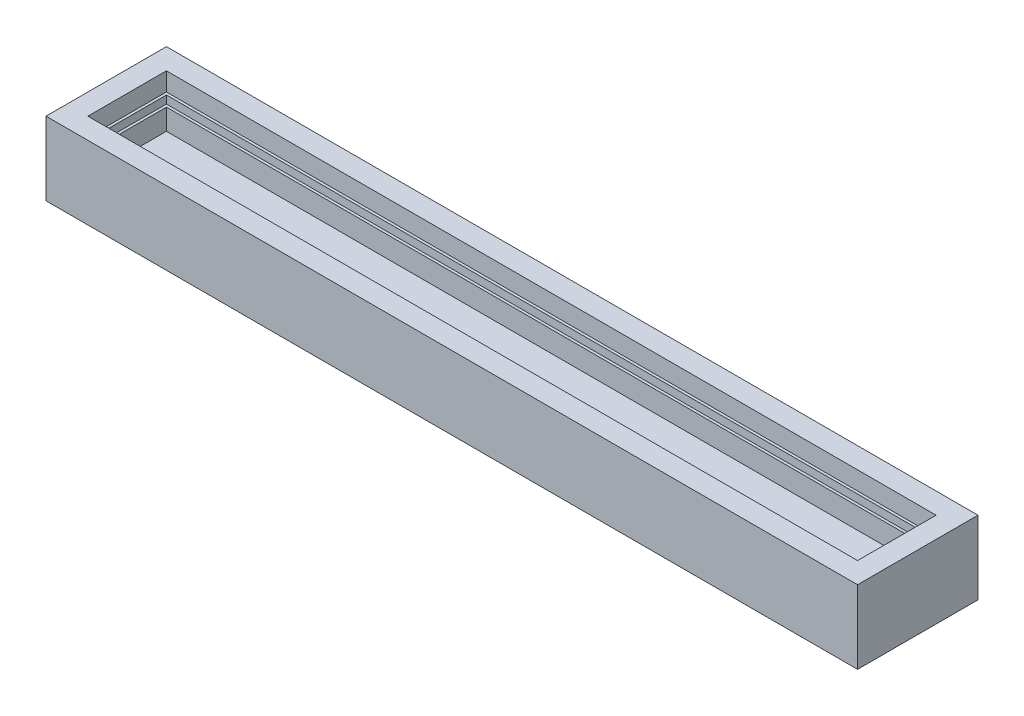
ISO-10303-21;
HEADER;
FILE_DESCRIPTION(('STEP AP214'),'2;1');
FILE_NAME('part.step','',(''),(''),'','','');
FILE_SCHEMA(('AUTOMOTIVE_DESIGN { 1 0 10303 214 1 1 1 1 }'));
ENDSEC;
DATA;
#1=APPLICATION_CONTEXT('core data for automotive mechanical design processes');
#2=APPLICATION_PROTOCOL_DEFINITION('international standard','automotive_design',2000,#1);
#3=PRODUCT_CONTEXT('',#1,'mechanical');
#4=PRODUCT('Part','Part','',(#3));
#5=PRODUCT_RELATED_PRODUCT_CATEGORY('part','',(#4));
#6=PRODUCT_DEFINITION_FORMATION('','',#4);
#7=PRODUCT_DEFINITION_CONTEXT('part definition',#1,'design');
#8=PRODUCT_DEFINITION('design','',#6,#7);
#9=PRODUCT_DEFINITION_SHAPE('','',#8);
#10=(LENGTH_UNIT() NAMED_UNIT(*) SI_UNIT(.MILLI.,.METRE.));
#11=(NAMED_UNIT(*) PLANE_ANGLE_UNIT() SI_UNIT($,.RADIAN.));
#12=(NAMED_UNIT(*) SI_UNIT($,.STERADIAN.) SOLID_ANGLE_UNIT());
#13=UNCERTAINTY_MEASURE_WITH_UNIT(LENGTH_MEASURE(1.E-05),#10,'distance_accuracy_value','');
#14=(GEOMETRIC_REPRESENTATION_CONTEXT(3) GLOBAL_UNCERTAINTY_ASSIGNED_CONTEXT((#13)) GLOBAL_UNIT_ASSIGNED_CONTEXT((#10,
#11,#12)) REPRESENTATION_CONTEXT('',''));
#15=CARTESIAN_POINT('',(0.,0.,0.));
#16=DIRECTION('',(0.,0.,1.));
#17=DIRECTION('',(1.,0.,0.));
#18=AXIS2_PLACEMENT_3D('',#15,#16,#17);
#19=CARTESIAN_POINT('',(73.5,10.,7.5));
#20=DIRECTION('',(-1.,0.,0.));
#21=DIRECTION('',(0.,0.,1.));
#22=AXIS2_PLACEMENT_3D('',#19,#20,#21);
#23=PLANE('',#22);
#24=DIRECTION('',(0.,-1.,0.));
#25=VECTOR('',#24,1.);
#26=CARTESIAN_POINT('',(73.5,10.,7.5));
#27=LINE('',#26,#25);
#28=CARTESIAN_POINT('',(73.5,6.,7.5));
#29=VERTEX_POINT('',#28);
#30=CARTESIAN_POINT('',(73.5,4.5,7.5));
#31=VERTEX_POINT('',#30);
#32=EDGE_CURVE('E328',#29,#31,#27,.T.);
#33=ORIENTED_EDGE('',*,*,#32,.F.);
#34=DIRECTION('',(0.,0.,-1.));
#35=VECTOR('',#34,1.);
#36=CARTESIAN_POINT('',(73.5,6.,7.5));
#37=LINE('',#36,#35);
#38=CARTESIAN_POINT('',(73.5,6.,-7.5));
#39=VERTEX_POINT('',#38);
#40=EDGE_CURVE('E49',#29,#39,#37,.T.);
#41=ORIENTED_EDGE('',*,*,#40,.T.);
#42=DIRECTION('',(0.,-1.,0.));
#43=VECTOR('',#42,1.);
#44=CARTESIAN_POINT('',(73.5,10.,-7.5));
#45=LINE('',#44,#43);
#46=CARTESIAN_POINT('',(73.5,4.5,-7.5));
#47=VERTEX_POINT('',#46);
#48=EDGE_CURVE('E343',#39,#47,#45,.T.);
#49=ORIENTED_EDGE('',*,*,#48,.T.);
#50=DIRECTION('',(0.,0.,-1.));
#51=VECTOR('',#50,1.);
#52=CARTESIAN_POINT('',(73.5,4.5,7.5));
#53=LINE('',#52,#51);
#54=EDGE_CURVE('E247',#31,#47,#53,.T.);
#55=ORIENTED_EDGE('',*,*,#54,.F.);
#56=EDGE_LOOP('',(#33,#41,#49,#55));
#57=FACE_BOUND('',#56,.T.);
#58=ADVANCED_FACE('F34',(#57),#23,.T.);
#59=CARTESIAN_POINT('',(-73.5,10.,-7.5));
#60=DIRECTION('',(0.,0.,1.));
#61=DIRECTION('',(1.,0.,0.));
#62=AXIS2_PLACEMENT_3D('',#59,#60,#61);
#63=PLANE('',#62);
#64=ORIENTED_EDGE('',*,*,#48,.F.);
#65=DIRECTION('',(-1.,0.,0.));
#66=VECTOR('',#65,1.);
#67=CARTESIAN_POINT('',(-73.5,6.,-7.5));
#68=LINE('',#67,#66);
#69=CARTESIAN_POINT('',(-73.5,6.,-7.5));
#70=VERTEX_POINT('',#69);
#71=EDGE_CURVE('E222',#39,#70,#68,.T.);
#72=ORIENTED_EDGE('',*,*,#71,.T.);
#73=DIRECTION('',(0.,-1.,0.));
#74=VECTOR('',#73,1.);
#75=CARTESIAN_POINT('',(-73.5,10.,-7.5));
#76=LINE('',#75,#74);
#77=CARTESIAN_POINT('',(-73.5,4.5,-7.5));
#78=VERTEX_POINT('',#77);
#79=EDGE_CURVE('E338',#70,#78,#76,.T.);
#80=ORIENTED_EDGE('',*,*,#79,.T.);
#81=DIRECTION('',(-1.,0.,0.));
#82=VECTOR('',#81,1.);
#83=CARTESIAN_POINT('',(73.5,4.5,-7.5));
#84=LINE('',#83,#82);
#85=EDGE_CURVE('E237',#47,#78,#84,.T.);
#86=ORIENTED_EDGE('',*,*,#85,.F.);
#87=EDGE_LOOP('',(#64,#72,#80,#86));
#88=FACE_BOUND('',#87,.T.);
#89=ADVANCED_FACE('F391',(#88),#63,.T.);
#90=CARTESIAN_POINT('',(-73.5,10.,7.5));
#91=DIRECTION('',(1.,0.,0.));
#92=DIRECTION('',(0.,0.,-1.));
#93=AXIS2_PLACEMENT_3D('',#90,#91,#92);
#94=PLANE('',#93);
#95=ORIENTED_EDGE('',*,*,#79,.F.);
#96=DIRECTION('',(0.,0.,1.));
#97=VECTOR('',#96,1.);
#98=CARTESIAN_POINT('',(-73.5,6.,7.5));
#99=LINE('',#98,#97);
#100=CARTESIAN_POINT('',(-73.5,6.,7.5));
#101=VERTEX_POINT('',#100);
#102=EDGE_CURVE('E218',#70,#101,#99,.T.);
#103=ORIENTED_EDGE('',*,*,#102,.T.);
#104=DIRECTION('',(0.,-1.,0.));
#105=VECTOR('',#104,1.);
#106=CARTESIAN_POINT('',(-73.5,10.,7.5));
#107=LINE('',#106,#105);
#108=CARTESIAN_POINT('',(-73.5,4.5,7.5));
#109=VERTEX_POINT('',#108);
#110=EDGE_CURVE('E333',#101,#109,#107,.T.);
#111=ORIENTED_EDGE('',*,*,#110,.T.);
#112=DIRECTION('',(0.,0.,1.));
#113=VECTOR('',#112,1.);
#114=CARTESIAN_POINT('',(-73.5,4.5,-7.5));
#115=LINE('',#114,#113);
#116=EDGE_CURVE('E240',#78,#109,#115,.T.);
#117=ORIENTED_EDGE('',*,*,#116,.F.);
#118=EDGE_LOOP('',(#95,#103,#111,#117));
#119=FACE_BOUND('',#118,.T.);
#120=ADVANCED_FACE('F386',(#119),#94,.T.);
#121=CARTESIAN_POINT('',(-73.5,10.,7.5));
#122=DIRECTION('',(0.,0.,-1.));
#123=DIRECTION('',(-1.,0.,0.));
#124=AXIS2_PLACEMENT_3D('',#121,#122,#123);
#125=PLANE('',#124);
#126=ORIENTED_EDGE('',*,*,#110,.F.);
#127=DIRECTION('',(1.,0.,0.));
#128=VECTOR('',#127,1.);
#129=CARTESIAN_POINT('',(-73.5,6.,7.5));
#130=LINE('',#129,#128);
#131=EDGE_CURVE('E42',#101,#29,#130,.T.);
#132=ORIENTED_EDGE('',*,*,#131,.T.);
#133=ORIENTED_EDGE('',*,*,#32,.T.);
#134=DIRECTION('',(1.,0.,0.));
#135=VECTOR('',#134,1.);
#136=CARTESIAN_POINT('',(-73.5,4.5,7.5));
#137=LINE('',#136,#135);
#138=EDGE_CURVE('E244',#109,#31,#137,.T.);
#139=ORIENTED_EDGE('',*,*,#138,.F.);
#140=EDGE_LOOP('',(#126,#132,#133,#139));
#141=FACE_BOUND('',#140,.T.);
#142=ADVANCED_FACE('F362',(#141),#125,.T.);
#143=CARTESIAN_POINT('',(0.,4.5,0.));
#144=DIRECTION('',(0.,1.,0.));
#145=DIRECTION('',(0.,0.,1.));
#146=AXIS2_PLACEMENT_3D('',#143,#144,#145);
#147=PLANE('',#146);
#148=DIRECTION('',(-1.,0.,0.));
#149=VECTOR('',#148,1.);
#150=CARTESIAN_POINT('',(74.5,4.5,-8.5));
#151=LINE('',#150,#149);
#152=CARTESIAN_POINT('',(74.5,4.5,-8.5));
#153=VERTEX_POINT('',#152);
#154=CARTESIAN_POINT('',(-74.5,4.5,-8.5));
#155=VERTEX_POINT('',#154);
#156=EDGE_CURVE('E261',#153,#155,#151,.T.);
#157=ORIENTED_EDGE('',*,*,#156,.F.);
#158=DIRECTION('',(0.,0.,-1.));
#159=VECTOR('',#158,1.);
#160=CARTESIAN_POINT('',(74.5,4.5,8.5));
#161=LINE('',#160,#159);
#162=CARTESIAN_POINT('',(74.5,4.5,8.5));
#163=VERTEX_POINT('',#162);
#164=EDGE_CURVE('E269',#163,#153,#161,.T.);
#165=ORIENTED_EDGE('',*,*,#164,.F.);
#166=DIRECTION('',(1.,0.,0.));
#167=VECTOR('',#166,1.);
#168=CARTESIAN_POINT('',(-74.5,4.5,8.5));
#169=LINE('',#168,#167);
#170=CARTESIAN_POINT('',(-74.5,4.5,8.5));
#171=VERTEX_POINT('',#170);
#172=EDGE_CURVE('E267',#171,#163,#169,.T.);
#173=ORIENTED_EDGE('',*,*,#172,.F.);
#174=DIRECTION('',(0.,0.,1.));
#175=VECTOR('',#174,1.);
#176=CARTESIAN_POINT('',(-74.5,4.5,-8.5));
#177=LINE('',#176,#175);
#178=EDGE_CURVE('E264',#155,#171,#177,.T.);
#179=ORIENTED_EDGE('',*,*,#178,.F.);
#180=EDGE_LOOP('',(#157,#165,#173,#179));
#181=FACE_BOUND('',#180,.T.);
#182=ORIENTED_EDGE('',*,*,#116,.T.);
#183=ORIENTED_EDGE('',*,*,#138,.T.);
#184=ORIENTED_EDGE('',*,*,#54,.T.);
#185=ORIENTED_EDGE('',*,*,#85,.T.);
#186=EDGE_LOOP('',(#182,#183,#184,#185));
#187=FACE_BOUND('',#186,.T.);
#188=ADVANCED_FACE('F388',(#181,#187),#147,.F.);
#189=CARTESIAN_POINT('',(0.,4.,0.));
#190=DIRECTION('',(0.,1.,0.));
#191=DIRECTION('',(0.,0.,1.));
#192=AXIS2_PLACEMENT_3D('',#189,#190,#191);
#193=PLANE('',#192);
#194=DIRECTION('',(-1.,0.,0.));
#195=VECTOR('',#194,1.);
#196=CARTESIAN_POINT('',(74.5,4.,-8.5));
#197=LINE('',#196,#195);
#198=CARTESIAN_POINT('',(74.5,4.,-8.5));
#199=VERTEX_POINT('',#198);
#200=CARTESIAN_POINT('',(-74.5,4.,-8.5));
#201=VERTEX_POINT('',#200);
#202=EDGE_CURVE('E250',#199,#201,#197,.T.);
#203=ORIENTED_EDGE('',*,*,#202,.T.);
#204=DIRECTION('',(0.,0.,1.));
#205=VECTOR('',#204,1.);
#206=CARTESIAN_POINT('',(-74.5,4.,-8.5));
#207=LINE('',#206,#205);
#208=CARTESIAN_POINT('',(-74.5,4.,8.5));
#209=VERTEX_POINT('',#208);
#210=EDGE_CURVE('E274',#201,#209,#207,.T.);
#211=ORIENTED_EDGE('',*,*,#210,.T.);
#212=DIRECTION('',(1.,0.,0.));
#213=VECTOR('',#212,1.);
#214=CARTESIAN_POINT('',(-74.5,4.,8.5));
#215=LINE('',#214,#213);
#216=CARTESIAN_POINT('',(74.5,4.,8.5));
#217=VERTEX_POINT('',#216);
#218=EDGE_CURVE('E276',#209,#217,#215,.T.);
#219=ORIENTED_EDGE('',*,*,#218,.T.);
#220=DIRECTION('',(0.,0.,-1.));
#221=VECTOR('',#220,1.);
#222=CARTESIAN_POINT('',(74.5,4.,8.5));
#223=LINE('',#222,#221);
#224=EDGE_CURVE('E265',#217,#199,#223,.T.);
#225=ORIENTED_EDGE('',*,*,#224,.T.);
#226=EDGE_LOOP('',(#203,#211,#219,#225));
#227=FACE_BOUND('',#226,.T.);
#228=DIRECTION('',(-1.,0.,0.));
#229=VECTOR('',#228,1.);
#230=CARTESIAN_POINT('',(73.5,4.,-7.5));
#231=LINE('',#230,#229);
#232=CARTESIAN_POINT('',(73.5,4.,-7.5));
#233=VERTEX_POINT('',#232);
#234=CARTESIAN_POINT('',(-73.5,4.,-7.5));
#235=VERTEX_POINT('',#234);
#236=EDGE_CURVE('E236',#233,#235,#231,.T.);
#237=ORIENTED_EDGE('',*,*,#236,.F.);
#238=DIRECTION('',(0.,0.,-1.));
#239=VECTOR('',#238,1.);
#240=CARTESIAN_POINT('',(73.5,4.,7.5));
#241=LINE('',#240,#239);
#242=CARTESIAN_POINT('',(73.5,4.,7.5));
#243=VERTEX_POINT('',#242);
#244=EDGE_CURVE('E241',#243,#233,#241,.T.);
#245=ORIENTED_EDGE('',*,*,#244,.F.);
#246=DIRECTION('',(1.,0.,0.));
#247=VECTOR('',#246,1.);
#248=CARTESIAN_POINT('',(-73.5,4.,7.5));
#249=LINE('',#248,#247);
#250=CARTESIAN_POINT('',(-73.5,4.,7.5));
#251=VERTEX_POINT('',#250);
#252=EDGE_CURVE('E256',#251,#243,#249,.T.);
#253=ORIENTED_EDGE('',*,*,#252,.F.);
#254=DIRECTION('',(0.,0.,1.));
#255=VECTOR('',#254,1.);
#256=CARTESIAN_POINT('',(-73.5,4.,-7.5));
#257=LINE('',#256,#255);
#258=EDGE_CURVE('E253',#235,#251,#257,.T.);
#259=ORIENTED_EDGE('',*,*,#258,.F.);
#260=EDGE_LOOP('',(#237,#245,#253,#259));
#261=FACE_BOUND('',#260,.T.);
#262=ADVANCED_FACE('F395',(#227,#261),#193,.T.);
#263=CARTESIAN_POINT('',(74.5,4.5,-8.5));
#264=DIRECTION('',(0.,0.,1.));
#265=DIRECTION('',(1.,0.,0.));
#266=AXIS2_PLACEMENT_3D('',#263,#264,#265);
#267=PLANE('',#266);
#268=ORIENTED_EDGE('',*,*,#202,.F.);
#269=DIRECTION('',(0.,-1.,0.));
#270=VECTOR('',#269,1.);
#271=CARTESIAN_POINT('',(74.5,4.5,-8.5));
#272=LINE('',#271,#270);
#273=EDGE_CURVE('E271',#153,#199,#272,.T.);
#274=ORIENTED_EDGE('',*,*,#273,.F.);
#275=ORIENTED_EDGE('',*,*,#156,.T.);
#276=DIRECTION('',(0.,-1.,0.));
#277=VECTOR('',#276,1.);
#278=CARTESIAN_POINT('',(-74.5,4.5,-8.5));
#279=LINE('',#278,#277);
#280=EDGE_CURVE('E287',#155,#201,#279,.T.);
#281=ORIENTED_EDGE('',*,*,#280,.T.);
#282=EDGE_LOOP('',(#268,#274,#275,#281));
#283=FACE_BOUND('',#282,.T.);
#284=ADVANCED_FACE('F397',(#283),#267,.T.);
#285=CARTESIAN_POINT('',(-74.5,4.5,-8.5));
#286=DIRECTION('',(1.,0.,0.));
#287=DIRECTION('',(0.,0.,-1.));
#288=AXIS2_PLACEMENT_3D('',#285,#286,#287);
#289=PLANE('',#288);
#290=ORIENTED_EDGE('',*,*,#210,.F.);
#291=ORIENTED_EDGE('',*,*,#280,.F.);
#292=ORIENTED_EDGE('',*,*,#178,.T.);
#293=DIRECTION('',(0.,-1.,0.));
#294=VECTOR('',#293,1.);
#295=CARTESIAN_POINT('',(-74.5,4.5,8.5));
#296=LINE('',#295,#294);
#297=EDGE_CURVE('E284',#171,#209,#296,.T.);
#298=ORIENTED_EDGE('',*,*,#297,.T.);
#299=EDGE_LOOP('',(#290,#291,#292,#298));
#300=FACE_BOUND('',#299,.T.);
#301=ADVANCED_FACE('F404',(#300),#289,.T.);
#302=CARTESIAN_POINT('',(-74.5,4.5,8.5));
#303=DIRECTION('',(0.,0.,-1.));
#304=DIRECTION('',(-1.,0.,0.));
#305=AXIS2_PLACEMENT_3D('',#302,#303,#304);
#306=PLANE('',#305);
#307=ORIENTED_EDGE('',*,*,#218,.F.);
#308=ORIENTED_EDGE('',*,*,#297,.F.);
#309=ORIENTED_EDGE('',*,*,#172,.T.);
#310=DIRECTION('',(0.,-1.,0.));
#311=VECTOR('',#310,1.);
#312=CARTESIAN_POINT('',(74.5,4.5,8.5));
#313=LINE('',#312,#311);
#314=EDGE_CURVE('E281',#163,#217,#313,.T.);
#315=ORIENTED_EDGE('',*,*,#314,.T.);
#316=EDGE_LOOP('',(#307,#308,#309,#315));
#317=FACE_BOUND('',#316,.T.);
#318=ADVANCED_FACE('F494',(#317),#306,.T.);
#319=CARTESIAN_POINT('',(74.5,4.5,8.5));
#320=DIRECTION('',(-1.,0.,0.));
#321=DIRECTION('',(0.,0.,1.));
#322=AXIS2_PLACEMENT_3D('',#319,#320,#321);
#323=PLANE('',#322);
#324=ORIENTED_EDGE('',*,*,#224,.F.);
#325=ORIENTED_EDGE('',*,*,#314,.F.);
#326=ORIENTED_EDGE('',*,*,#164,.T.);
#327=ORIENTED_EDGE('',*,*,#273,.T.);
#328=EDGE_LOOP('',(#324,#325,#326,#327));
#329=FACE_BOUND('',#328,.T.);
#330=ADVANCED_FACE('F456',(#329),#323,.T.);
#331=CARTESIAN_POINT('',(0.,0.,0.));
#332=DIRECTION('',(0.,-1.,0.));
#333=DIRECTION('',(0.,0.,-1.));
#334=AXIS2_PLACEMENT_3D('',#331,#332,#333);
#335=PLANE('',#334);
#336=DIRECTION('',(0.,0.,1.));
#337=VECTOR('',#336,1.);
#338=CARTESIAN_POINT('',(-73.5,0.,7.5));
#339=LINE('',#338,#337);
#340=CARTESIAN_POINT('',(-73.5,0.,-7.5));
#341=VERTEX_POINT('',#340);
#342=CARTESIAN_POINT('',(-73.5,0.,7.5));
#343=VERTEX_POINT('',#342);
#344=EDGE_CURVE('E319',#341,#343,#339,.T.);
#345=ORIENTED_EDGE('',*,*,#344,.T.);
#346=DIRECTION('',(1.,0.,0.));
#347=VECTOR('',#346,1.);
#348=CARTESIAN_POINT('',(-73.5,0.,7.5));
#349=LINE('',#348,#347);
#350=CARTESIAN_POINT('',(73.5,0.,7.5));
#351=VERTEX_POINT('',#350);
#352=EDGE_CURVE('E306',#343,#351,#349,.T.);
#353=ORIENTED_EDGE('',*,*,#352,.T.);
#354=DIRECTION('',(0.,0.,-1.));
#355=VECTOR('',#354,1.);
#356=CARTESIAN_POINT('',(73.5,0.,7.5));
#357=LINE('',#356,#355);
#358=CARTESIAN_POINT('',(73.5,0.,-7.5));
#359=VERTEX_POINT('',#358);
#360=EDGE_CURVE('E302',#351,#359,#357,.T.);
#361=ORIENTED_EDGE('',*,*,#360,.T.);
#362=DIRECTION('',(-1.,0.,0.));
#363=VECTOR('',#362,1.);
#364=CARTESIAN_POINT('',(-73.5,0.,-7.5));
#365=LINE('',#364,#363);
#366=EDGE_CURVE('E316',#359,#341,#365,.T.);
#367=ORIENTED_EDGE('',*,*,#366,.T.);
#368=EDGE_LOOP('',(#345,#353,#361,#367));
#369=FACE_BOUND('',#368,.T.);
#370=ADVANCED_FACE('F378',(#369),#335,.F.);
#371=EDGE_CURVE('E327',#251,#343,#107,.T.);
#372=ORIENTED_EDGE('',*,*,#371,.F.);
#373=ORIENTED_EDGE('',*,*,#252,.T.);
#374=EDGE_CURVE('E313',#243,#351,#27,.T.);
#375=ORIENTED_EDGE('',*,*,#374,.T.);
#376=ORIENTED_EDGE('',*,*,#352,.F.);
#377=EDGE_LOOP('',(#372,#373,#375,#376));
#378=FACE_BOUND('',#377,.T.);
#379=ADVANCED_FACE('F372',(#378),#125,.T.);
#380=EDGE_CURVE('E332',#235,#341,#76,.T.);
#381=ORIENTED_EDGE('',*,*,#380,.F.);
#382=ORIENTED_EDGE('',*,*,#258,.T.);
#383=ORIENTED_EDGE('',*,*,#371,.T.);
#384=ORIENTED_EDGE('',*,*,#344,.F.);
#385=EDGE_LOOP('',(#381,#382,#383,#384));
#386=FACE_BOUND('',#385,.T.);
#387=ADVANCED_FACE('F382',(#386),#94,.T.);
#388=EDGE_CURVE('E337',#233,#359,#45,.T.);
#389=ORIENTED_EDGE('',*,*,#388,.F.);
#390=ORIENTED_EDGE('',*,*,#236,.T.);
#391=ORIENTED_EDGE('',*,*,#380,.T.);
#392=ORIENTED_EDGE('',*,*,#366,.F.);
#393=EDGE_LOOP('',(#389,#390,#391,#392));
#394=FACE_BOUND('',#393,.T.);
#395=ADVANCED_FACE('F393',(#394),#63,.T.);
#396=ORIENTED_EDGE('',*,*,#374,.F.);
#397=ORIENTED_EDGE('',*,*,#244,.T.);
#398=ORIENTED_EDGE('',*,*,#388,.T.);
#399=ORIENTED_EDGE('',*,*,#360,.F.);
#400=EDGE_LOOP('',(#396,#397,#398,#399));
#401=FACE_BOUND('',#400,.T.);
#402=ADVANCED_FACE('F374',(#401),#23,.T.);
#403=CARTESIAN_POINT('',(74.5,6.5,8.5));
#404=DIRECTION('',(-1.,0.,0.));
#405=DIRECTION('',(0.,0.,1.));
#406=AXIS2_PLACEMENT_3D('',#403,#404,#405);
#407=PLANE('',#406);
#408=DIRECTION('',(0.,0.,-1.));
#409=VECTOR('',#408,1.);
#410=CARTESIAN_POINT('',(74.5,6.,8.5));
#411=LINE('',#410,#409);
#412=CARTESIAN_POINT('',(74.5,6.,8.5));
#413=VERTEX_POINT('',#412);
#414=CARTESIAN_POINT('',(74.5,6.,-8.5));
#415=VERTEX_POINT('',#414);
#416=EDGE_CURVE('E702',#413,#415,#411,.T.);
#417=ORIENTED_EDGE('',*,*,#416,.F.);
#418=DIRECTION('',(0.,-1.,0.));
#419=VECTOR('',#418,1.);
#420=CARTESIAN_POINT('',(74.5,6.5,8.5));
#421=LINE('',#420,#419);
#422=CARTESIAN_POINT('',(74.5,6.5,8.5));
#423=VERTEX_POINT('',#422);
#424=EDGE_CURVE('E213',#423,#413,#421,.T.);
#425=ORIENTED_EDGE('',*,*,#424,.F.);
#426=DIRECTION('',(0.,0.,-1.));
#427=VECTOR('',#426,1.);
#428=CARTESIAN_POINT('',(74.5,6.5,8.5));
#429=LINE('',#428,#427);
#430=CARTESIAN_POINT('',(74.5,6.5,-8.5));
#431=VERTEX_POINT('',#430);
#432=EDGE_CURVE('E198',#423,#431,#429,.T.);
#433=ORIENTED_EDGE('',*,*,#432,.T.);
#434=DIRECTION('',(0.,-1.,0.));
#435=VECTOR('',#434,1.);
#436=CARTESIAN_POINT('',(74.5,6.5,-8.5));
#437=LINE('',#436,#435);
#438=EDGE_CURVE('E210',#431,#415,#437,.T.);
#439=ORIENTED_EDGE('',*,*,#438,.T.);
#440=EDGE_LOOP('',(#417,#425,#433,#439));
#441=FACE_BOUND('',#440,.T.);
#442=ADVANCED_FACE('F209',(#441),#407,.T.);
#443=CARTESIAN_POINT('',(74.5,6.5,-8.5));
#444=DIRECTION('',(0.,0.,1.));
#445=DIRECTION('',(1.,0.,0.));
#446=AXIS2_PLACEMENT_3D('',#443,#444,#445);
#447=PLANE('',#446);
#448=DIRECTION('',(-1.,0.,0.));
#449=VECTOR('',#448,1.);
#450=CARTESIAN_POINT('',(74.5,6.,-8.5));
#451=LINE('',#450,#449);
#452=CARTESIAN_POINT('',(-74.5,6.,-8.5));
#453=VERTEX_POINT('',#452);
#454=EDGE_CURVE('E217',#415,#453,#451,.T.);
#455=ORIENTED_EDGE('',*,*,#454,.F.);
#456=ORIENTED_EDGE('',*,*,#438,.F.);
#457=DIRECTION('',(-1.,0.,0.));
#458=VECTOR('',#457,1.);
#459=CARTESIAN_POINT('',(74.5,6.5,-8.5));
#460=LINE('',#459,#458);
#461=CARTESIAN_POINT('',(-74.5,6.5,-8.5));
#462=VERTEX_POINT('',#461);
#463=EDGE_CURVE('E194',#431,#462,#460,.T.);
#464=ORIENTED_EDGE('',*,*,#463,.T.);
#465=DIRECTION('',(0.,-1.,0.));
#466=VECTOR('',#465,1.);
#467=CARTESIAN_POINT('',(-74.5,6.5,-8.5));
#468=LINE('',#467,#466);
#469=EDGE_CURVE('E219',#462,#453,#468,.T.);
#470=ORIENTED_EDGE('',*,*,#469,.T.);
#471=EDGE_LOOP('',(#455,#456,#464,#470));
#472=FACE_BOUND('',#471,.T.);
#473=ADVANCED_FACE('F216',(#472),#447,.T.);
#474=CARTESIAN_POINT('',(-74.5,6.5,-8.5));
#475=DIRECTION('',(1.,0.,0.));
#476=DIRECTION('',(0.,0.,-1.));
#477=AXIS2_PLACEMENT_3D('',#474,#475,#476);
#478=PLANE('',#477);
#479=DIRECTION('',(0.,0.,1.));
#480=VECTOR('',#479,1.);
#481=CARTESIAN_POINT('',(-74.5,6.,-8.5));
#482=LINE('',#481,#480);
#483=CARTESIAN_POINT('',(-74.5,6.,8.5));
#484=VERTEX_POINT('',#483);
#485=EDGE_CURVE('E705',#453,#484,#482,.T.);
#486=ORIENTED_EDGE('',*,*,#485,.F.);
#487=ORIENTED_EDGE('',*,*,#469,.F.);
#488=DIRECTION('',(0.,0.,1.));
#489=VECTOR('',#488,1.);
#490=CARTESIAN_POINT('',(-74.5,6.5,-8.5));
#491=LINE('',#490,#489);
#492=CARTESIAN_POINT('',(-74.5,6.5,8.5));
#493=VERTEX_POINT('',#492);
#494=EDGE_CURVE('E199',#462,#493,#491,.T.);
#495=ORIENTED_EDGE('',*,*,#494,.T.);
#496=DIRECTION('',(0.,-1.,0.));
#497=VECTOR('',#496,1.);
#498=CARTESIAN_POINT('',(-74.5,6.5,8.5));
#499=LINE('',#498,#497);
#500=EDGE_CURVE('E224',#493,#484,#499,.T.);
#501=ORIENTED_EDGE('',*,*,#500,.T.);
#502=EDGE_LOOP('',(#486,#487,#495,#501));
#503=FACE_BOUND('',#502,.T.);
#504=ADVANCED_FACE('F563',(#503),#478,.T.);
#505=CARTESIAN_POINT('',(-74.5,6.5,8.5));
#506=DIRECTION('',(0.,0.,-1.));
#507=DIRECTION('',(-1.,0.,0.));
#508=AXIS2_PLACEMENT_3D('',#505,#506,#507);
#509=PLANE('',#508);
#510=DIRECTION('',(1.,0.,0.));
#511=VECTOR('',#510,1.);
#512=CARTESIAN_POINT('',(-74.5,6.,8.5));
#513=LINE('',#512,#511);
#514=EDGE_CURVE('E214',#484,#413,#513,.T.);
#515=ORIENTED_EDGE('',*,*,#514,.F.);
#516=ORIENTED_EDGE('',*,*,#500,.F.);
#517=DIRECTION('',(1.,0.,0.));
#518=VECTOR('',#517,1.);
#519=CARTESIAN_POINT('',(-74.5,6.5,8.5));
#520=LINE('',#519,#518);
#521=EDGE_CURVE('E708',#493,#423,#520,.T.);
#522=ORIENTED_EDGE('',*,*,#521,.T.);
#523=ORIENTED_EDGE('',*,*,#424,.T.);
#524=EDGE_LOOP('',(#515,#516,#522,#523));
#525=FACE_BOUND('',#524,.T.);
#526=ADVANCED_FACE('F571',(#525),#509,.T.);
#527=CARTESIAN_POINT('',(0.,6.5,0.));
#528=DIRECTION('',(0.,1.,0.));
#529=DIRECTION('',(0.,0.,1.));
#530=AXIS2_PLACEMENT_3D('',#527,#528,#529);
#531=PLANE('',#530);
#532=DIRECTION('',(0.,0.,-1.));
#533=VECTOR('',#532,1.);
#534=CARTESIAN_POINT('',(73.5,6.5,7.5));
#535=LINE('',#534,#533);
#536=CARTESIAN_POINT('',(73.5,6.5,7.5));
#537=VERTEX_POINT('',#536);
#538=CARTESIAN_POINT('',(73.5,6.5,-7.5));
#539=VERTEX_POINT('',#538);
#540=EDGE_CURVE('E234',#537,#539,#535,.T.);
#541=ORIENTED_EDGE('',*,*,#540,.T.);
#542=DIRECTION('',(-1.,0.,0.));
#543=VECTOR('',#542,1.);
#544=CARTESIAN_POINT('',(-73.5,6.5,-7.5));
#545=LINE('',#544,#543);
#546=CARTESIAN_POINT('',(-73.5,6.5,-7.5));
#547=VERTEX_POINT('',#546);
#548=EDGE_CURVE('E232',#539,#547,#545,.T.);
#549=ORIENTED_EDGE('',*,*,#548,.T.);
#550=DIRECTION('',(0.,0.,1.));
#551=VECTOR('',#550,1.);
#552=CARTESIAN_POINT('',(-73.5,6.5,7.5));
#553=LINE('',#552,#551);
#554=CARTESIAN_POINT('',(-73.5,6.5,7.5));
#555=VERTEX_POINT('',#554);
#556=EDGE_CURVE('E56',#547,#555,#553,.T.);
#557=ORIENTED_EDGE('',*,*,#556,.T.);
#558=DIRECTION('',(1.,0.,0.));
#559=VECTOR('',#558,1.);
#560=CARTESIAN_POINT('',(-73.5,6.5,7.5));
#561=LINE('',#560,#559);
#562=EDGE_CURVE('E11',#555,#537,#561,.T.);
#563=ORIENTED_EDGE('',*,*,#562,.T.);
#564=EDGE_LOOP('',(#541,#549,#557,#563));
#565=FACE_BOUND('',#564,.T.);
#566=ORIENTED_EDGE('',*,*,#432,.F.);
#567=ORIENTED_EDGE('',*,*,#521,.F.);
#568=ORIENTED_EDGE('',*,*,#494,.F.);
#569=ORIENTED_EDGE('',*,*,#463,.F.);
#570=EDGE_LOOP('',(#566,#567,#568,#569));
#571=FACE_BOUND('',#570,.T.);
#572=ADVANCED_FACE('F196',(#565,#571),#531,.F.);
#573=CARTESIAN_POINT('',(0.,6.,0.));
#574=DIRECTION('',(0.,1.,0.));
#575=DIRECTION('',(0.,0.,1.));
#576=AXIS2_PLACEMENT_3D('',#573,#574,#575);
#577=PLANE('',#576);
#578=ORIENTED_EDGE('',*,*,#131,.F.);
#579=ORIENTED_EDGE('',*,*,#102,.F.);
#580=ORIENTED_EDGE('',*,*,#71,.F.);
#581=ORIENTED_EDGE('',*,*,#40,.F.);
#582=EDGE_LOOP('',(#578,#579,#580,#581));
#583=FACE_BOUND('',#582,.T.);
#584=ORIENTED_EDGE('',*,*,#416,.T.);
#585=ORIENTED_EDGE('',*,*,#454,.T.);
#586=ORIENTED_EDGE('',*,*,#485,.T.);
#587=ORIENTED_EDGE('',*,*,#514,.T.);
#588=EDGE_LOOP('',(#584,#585,#586,#587));
#589=FACE_BOUND('',#588,.T.);
#590=ADVANCED_FACE('F588',(#583,#589),#577,.T.);
#591=CARTESIAN_POINT('',(0.,-4.,0.));
#592=DIRECTION('',(0.,-1.,0.));
#593=DIRECTION('',(0.,0.,-1.));
#594=AXIS2_PLACEMENT_3D('',#591,#592,#593);
#595=PLANE('',#594);
#596=DIRECTION('',(1.,0.,0.));
#597=VECTOR('',#596,1.);
#598=CARTESIAN_POINT('',(-77.5,-4.,-11.5));
#599=LINE('',#598,#597);
#600=CARTESIAN_POINT('',(-77.5,-4.,-11.5));
#601=VERTEX_POINT('',#600);
#602=CARTESIAN_POINT('',(77.5,-4.,-11.5));
#603=VERTEX_POINT('',#602);
#604=EDGE_CURVE('E290',#601,#603,#599,.T.);
#605=ORIENTED_EDGE('',*,*,#604,.T.);
#606=DIRECTION('',(0.,0.,1.));
#607=VECTOR('',#606,1.);
#608=CARTESIAN_POINT('',(77.5,-4.,-11.5));
#609=LINE('',#608,#607);
#610=CARTESIAN_POINT('',(77.5,-4.,11.5));
#611=VERTEX_POINT('',#610);
#612=EDGE_CURVE('E293',#603,#611,#609,.T.);
#613=ORIENTED_EDGE('',*,*,#612,.T.);
#614=DIRECTION('',(-1.,0.,0.));
#615=VECTOR('',#614,1.);
#616=CARTESIAN_POINT('',(77.5,-4.,11.5));
#617=LINE('',#616,#615);
#618=CARTESIAN_POINT('',(-77.5,-4.,11.5));
#619=VERTEX_POINT('',#618);
#620=EDGE_CURVE('E296',#611,#619,#617,.T.);
#621=ORIENTED_EDGE('',*,*,#620,.T.);
#622=DIRECTION('',(0.,0.,-1.));
#623=VECTOR('',#622,1.);
#624=CARTESIAN_POINT('',(-77.5,-4.,11.5));
#625=LINE('',#624,#623);
#626=EDGE_CURVE('E299',#619,#601,#625,.T.);
#627=ORIENTED_EDGE('',*,*,#626,.T.);
#628=EDGE_LOOP('',(#605,#613,#621,#627));
#629=FACE_BOUND('',#628,.T.);
#630=ADVANCED_FACE('F475',(#629),#595,.T.);
#631=CARTESIAN_POINT('',(-77.5,10.,11.5));
#632=DIRECTION('',(0.,0.,-1.));
#633=DIRECTION('',(-1.,0.,0.));
#634=AXIS2_PLACEMENT_3D('',#631,#632,#633);
#635=PLANE('',#634);
#636=DIRECTION('',(0.,-1.,0.));
#637=VECTOR('',#636,1.);
#638=CARTESIAN_POINT('',(-77.5,10.,11.5));
#639=LINE('',#638,#637);
#640=CARTESIAN_POINT('',(-77.5,10.,11.5));
#641=VERTEX_POINT('',#640);
#642=EDGE_CURVE('E354',#641,#619,#639,.T.);
#643=ORIENTED_EDGE('',*,*,#642,.T.);
#644=ORIENTED_EDGE('',*,*,#620,.F.);
#645=DIRECTION('',(0.,-1.,0.));
#646=VECTOR('',#645,1.);
#647=CARTESIAN_POINT('',(77.5,10.,11.5));
#648=LINE('',#647,#646);
#649=CARTESIAN_POINT('',(77.5,10.,11.5));
#650=VERTEX_POINT('',#649);
#651=EDGE_CURVE('E352',#650,#611,#648,.T.);
#652=ORIENTED_EDGE('',*,*,#651,.F.);
#653=DIRECTION('',(1.,0.,0.));
#654=VECTOR('',#653,1.);
#655=CARTESIAN_POINT('',(-77.5,10.,11.5));
#656=LINE('',#655,#654);
#657=EDGE_CURVE('E350',#641,#650,#656,.T.);
#658=ORIENTED_EDGE('',*,*,#657,.F.);
#659=EDGE_LOOP('',(#643,#644,#652,#658));
#660=FACE_BOUND('',#659,.T.);
#661=ADVANCED_FACE('F621',(#660),#635,.F.);
#662=CARTESIAN_POINT('',(-77.5,10.,11.5));
#663=DIRECTION('',(1.,0.,0.));
#664=DIRECTION('',(0.,0.,-1.));
#665=AXIS2_PLACEMENT_3D('',#662,#663,#664);
#666=PLANE('',#665);
#667=DIRECTION('',(0.,-1.,0.));
#668=VECTOR('',#667,1.);
#669=CARTESIAN_POINT('',(-77.5,10.,-11.5));
#670=LINE('',#669,#668);
#671=CARTESIAN_POINT('',(-77.5,10.,-11.5));
#672=VERTEX_POINT('',#671);
#673=EDGE_CURVE('E356',#672,#601,#670,.T.);
#674=ORIENTED_EDGE('',*,*,#673,.T.);
#675=ORIENTED_EDGE('',*,*,#626,.F.);
#676=ORIENTED_EDGE('',*,*,#642,.F.);
#677=DIRECTION('',(0.,0.,1.));
#678=VECTOR('',#677,1.);
#679=CARTESIAN_POINT('',(-77.5,10.,11.5));
#680=LINE('',#679,#678);
#681=EDGE_CURVE('E348',#672,#641,#680,.T.);
#682=ORIENTED_EDGE('',*,*,#681,.F.);
#683=EDGE_LOOP('',(#674,#675,#676,#682));
#684=FACE_BOUND('',#683,.T.);
#685=ADVANCED_FACE('F627',(#684),#666,.F.);
#686=CARTESIAN_POINT('',(-77.5,10.,-11.5));
#687=DIRECTION('',(0.,0.,1.));
#688=DIRECTION('',(1.,0.,0.));
#689=AXIS2_PLACEMENT_3D('',#686,#687,#688);
#690=PLANE('',#689);
#691=DIRECTION('',(0.,-1.,0.));
#692=VECTOR('',#691,1.);
#693=CARTESIAN_POINT('',(77.5,10.,-11.5));
#694=LINE('',#693,#692);
#695=CARTESIAN_POINT('',(77.5,10.,-11.5));
#696=VERTEX_POINT('',#695);
#697=EDGE_CURVE('E358',#696,#603,#694,.T.);
#698=ORIENTED_EDGE('',*,*,#697,.T.);
#699=ORIENTED_EDGE('',*,*,#604,.F.);
#700=ORIENTED_EDGE('',*,*,#673,.F.);
#701=DIRECTION('',(-1.,0.,0.));
#702=VECTOR('',#701,1.);
#703=CARTESIAN_POINT('',(-77.5,10.,-11.5));
#704=LINE('',#703,#702);
#705=EDGE_CURVE('E346',#696,#672,#704,.T.);
#706=ORIENTED_EDGE('',*,*,#705,.F.);
#707=EDGE_LOOP('',(#698,#699,#700,#706));
#708=FACE_BOUND('',#707,.T.);
#709=ADVANCED_FACE('F639',(#708),#690,.F.);
#710=CARTESIAN_POINT('',(77.5,10.,11.5));
#711=DIRECTION('',(-1.,0.,0.));
#712=DIRECTION('',(0.,0.,1.));
#713=AXIS2_PLACEMENT_3D('',#710,#711,#712);
#714=PLANE('',#713);
#715=ORIENTED_EDGE('',*,*,#651,.T.);
#716=ORIENTED_EDGE('',*,*,#612,.F.);
#717=ORIENTED_EDGE('',*,*,#697,.F.);
#718=DIRECTION('',(0.,0.,-1.));
#719=VECTOR('',#718,1.);
#720=CARTESIAN_POINT('',(77.5,10.,11.5));
#721=LINE('',#720,#719);
#722=EDGE_CURVE('E342',#650,#696,#721,.T.);
#723=ORIENTED_EDGE('',*,*,#722,.F.);
#724=EDGE_LOOP('',(#715,#716,#717,#723));
#725=FACE_BOUND('',#724,.T.);
#726=ADVANCED_FACE('F36',(#725),#714,.F.);
#727=CARTESIAN_POINT('',(0.,10.,0.));
#728=DIRECTION('',(0.,-1.,0.));
#729=DIRECTION('',(0.,0.,-1.));
#730=AXIS2_PLACEMENT_3D('',#727,#728,#729);
#731=PLANE('',#730);
#732=ORIENTED_EDGE('',*,*,#722,.T.);
#733=ORIENTED_EDGE('',*,*,#705,.T.);
#734=ORIENTED_EDGE('',*,*,#681,.T.);
#735=ORIENTED_EDGE('',*,*,#657,.T.);
#736=EDGE_LOOP('',(#732,#733,#734,#735));
#737=FACE_BOUND('',#736,.T.);
#738=DIRECTION('',(0.,0.,-1.));
#739=VECTOR('',#738,1.);
#740=CARTESIAN_POINT('',(73.5,10.,7.5));
#741=LINE('',#740,#739);
#742=CARTESIAN_POINT('',(73.5,10.,7.5));
#743=VERTEX_POINT('',#742);
#744=CARTESIAN_POINT('',(73.5,10.,-7.5));
#745=VERTEX_POINT('',#744);
#746=EDGE_CURVE('E303',#743,#745,#741,.T.);
#747=ORIENTED_EDGE('',*,*,#746,.F.);
#748=DIRECTION('',(1.,0.,0.));
#749=VECTOR('',#748,1.);
#750=CARTESIAN_POINT('',(-73.5,10.,7.5));
#751=LINE('',#750,#749);
#752=CARTESIAN_POINT('',(-73.5,10.,7.5));
#753=VERTEX_POINT('',#752);
#754=EDGE_CURVE('E311',#753,#743,#751,.T.);
#755=ORIENTED_EDGE('',*,*,#754,.F.);
#756=DIRECTION('',(0.,0.,1.));
#757=VECTOR('',#756,1.);
#758=CARTESIAN_POINT('',(-73.5,10.,7.5));
#759=LINE('',#758,#757);
#760=CARTESIAN_POINT('',(-73.5,10.,-7.5));
#761=VERTEX_POINT('',#760);
#762=EDGE_CURVE('E308',#761,#753,#759,.T.);
#763=ORIENTED_EDGE('',*,*,#762,.F.);
#764=DIRECTION('',(-1.,0.,0.));
#765=VECTOR('',#764,1.);
#766=CARTESIAN_POINT('',(-73.5,10.,-7.5));
#767=LINE('',#766,#765);
#768=EDGE_CURVE('E305',#745,#761,#767,.T.);
#769=ORIENTED_EDGE('',*,*,#768,.F.);
#770=EDGE_LOOP('',(#747,#755,#763,#769));
#771=FACE_BOUND('',#770,.T.);
#772=ADVANCED_FACE('F437',(#737,#771),#731,.F.);
#773=ORIENTED_EDGE('',*,*,#562,.F.);
#774=EDGE_CURVE('E329',#753,#555,#107,.T.);
#775=ORIENTED_EDGE('',*,*,#774,.F.);
#776=ORIENTED_EDGE('',*,*,#754,.T.);
#777=EDGE_CURVE('E324',#743,#537,#27,.T.);
#778=ORIENTED_EDGE('',*,*,#777,.T.);
#779=EDGE_LOOP('',(#773,#775,#776,#778));
#780=FACE_BOUND('',#779,.T.);
#781=ADVANCED_FACE('F433',(#780),#125,.T.);
#782=ORIENTED_EDGE('',*,*,#556,.F.);
#783=EDGE_CURVE('E334',#761,#547,#76,.T.);
#784=ORIENTED_EDGE('',*,*,#783,.F.);
#785=ORIENTED_EDGE('',*,*,#762,.T.);
#786=ORIENTED_EDGE('',*,*,#774,.T.);
#787=EDGE_LOOP('',(#782,#784,#785,#786));
#788=FACE_BOUND('',#787,.T.);
#789=ADVANCED_FACE('F425',(#788),#94,.T.);
#790=ORIENTED_EDGE('',*,*,#548,.F.);
#791=EDGE_CURVE('E339',#745,#539,#45,.T.);
#792=ORIENTED_EDGE('',*,*,#791,.F.);
#793=ORIENTED_EDGE('',*,*,#768,.T.);
#794=ORIENTED_EDGE('',*,*,#783,.T.);
#795=EDGE_LOOP('',(#790,#792,#793,#794));
#796=FACE_BOUND('',#795,.T.);
#797=ADVANCED_FACE('F417',(#796),#63,.T.);
#798=ORIENTED_EDGE('',*,*,#540,.F.);
#799=ORIENTED_EDGE('',*,*,#777,.F.);
#800=ORIENTED_EDGE('',*,*,#746,.T.);
#801=ORIENTED_EDGE('',*,*,#791,.T.);
#802=EDGE_LOOP('',(#798,#799,#800,#801));
#803=FACE_BOUND('',#802,.T.);
#804=ADVANCED_FACE('F412',(#803),#23,.T.);
#805=CLOSED_SHELL('',(#58,#89,#120,#142,#188,#262,#284,#301,#318,#330,#370,#379,#387,#395,#402,
#442,#473,#504,#526,#572,#590,#630,#661,#685,#709,#726,#772,#781,#789,#797,#804));
#806=MANIFOLD_SOLID_BREP('B2',#805);
#807=ADVANCED_BREP_SHAPE_REPRESENTATION('',(#18,#806),#14);
#808=SHAPE_DEFINITION_REPRESENTATION(#9,#807);
ENDSEC;
END-ISO-10303-21;
